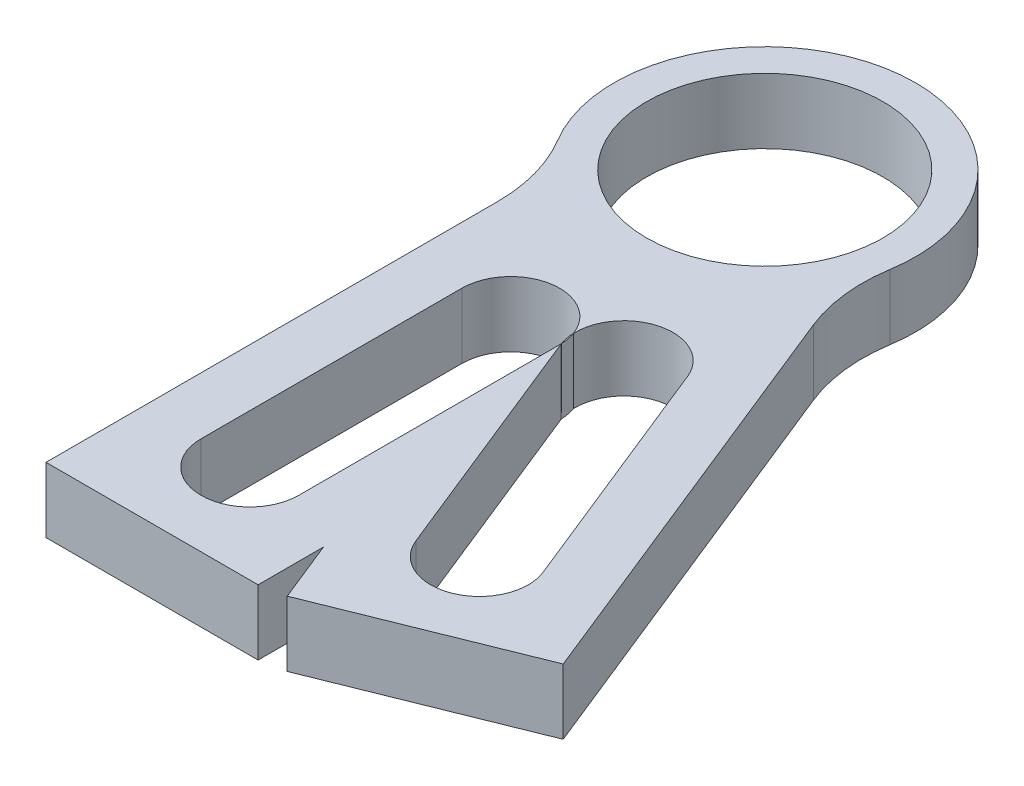
ISO-10303-21;
HEADER;
FILE_DESCRIPTION(('STEP AP214'),'2;1');
FILE_NAME('part.step','',(''),(''),'','','');
FILE_SCHEMA(('AUTOMOTIVE_DESIGN { 1 0 10303 214 1 1 1 1 }'));
ENDSEC;
DATA;
#1=APPLICATION_CONTEXT('core data for automotive mechanical design processes');
#2=APPLICATION_PROTOCOL_DEFINITION('international standard','automotive_design',2000,#1);
#3=PRODUCT_CONTEXT('',#1,'mechanical');
#4=PRODUCT('Part','Part','',(#3));
#5=PRODUCT_RELATED_PRODUCT_CATEGORY('part','',(#4));
#6=PRODUCT_DEFINITION_FORMATION('','',#4);
#7=PRODUCT_DEFINITION_CONTEXT('part definition',#1,'design');
#8=PRODUCT_DEFINITION('design','',#6,#7);
#9=PRODUCT_DEFINITION_SHAPE('','',#8);
#10=(LENGTH_UNIT() NAMED_UNIT(*) SI_UNIT(.MILLI.,.METRE.));
#11=(NAMED_UNIT(*) PLANE_ANGLE_UNIT() SI_UNIT($,.RADIAN.));
#12=(NAMED_UNIT(*) SI_UNIT($,.STERADIAN.) SOLID_ANGLE_UNIT());
#13=UNCERTAINTY_MEASURE_WITH_UNIT(LENGTH_MEASURE(1.E-05),#10,'distance_accuracy_value','');
#14=(GEOMETRIC_REPRESENTATION_CONTEXT(3) GLOBAL_UNCERTAINTY_ASSIGNED_CONTEXT((#13)) GLOBAL_UNIT_ASSIGNED_CONTEXT((#10,
#11,#12)) REPRESENTATION_CONTEXT('',''));
#15=CARTESIAN_POINT('',(0.,0.,0.));
#16=DIRECTION('',(0.,0.,1.));
#17=DIRECTION('',(1.,0.,0.));
#18=AXIS2_PLACEMENT_3D('',#15,#16,#17);
#19=CARTESIAN_POINT('',(0.,6.35,0.));
#20=DIRECTION('',(0.,-1.,0.));
#21=DIRECTION('',(0.,0.,-1.));
#22=AXIS2_PLACEMENT_3D('',#19,#20,#21);
#23=CYLINDRICAL_SURFACE('',#22,14.6812);
#24=CARTESIAN_POINT('',(0.,6.35,0.));
#25=DIRECTION('',(0.,1.,0.));
#26=DIRECTION('',(0.,0.,1.));
#27=AXIS2_PLACEMENT_3D('',#24,#25,#26);
#28=CIRCLE('',#27,14.6812);
#29=CARTESIAN_POINT('',(14.4988560701764,6.35,2.30668725585171));
#30=VERTEX_POINT('',#29);
#31=CARTESIAN_POINT('',(-12.5882442227764,6.35,7.55471646243172));
#32=VERTEX_POINT('',#31);
#33=EDGE_CURVE('E308',#30,#32,#28,.T.);
#34=ORIENTED_EDGE('',*,*,#33,.F.);
#35=DIRECTION('',(0.,-1.,0.));
#36=VECTOR('',#35,1.);
#37=CARTESIAN_POINT('',(14.4988560701764,6.35,2.30668725585171));
#38=LINE('',#37,#36);
#39=CARTESIAN_POINT('',(14.4988560701764,0.,2.30668725585171));
#40=VERTEX_POINT('',#39);
#41=EDGE_CURVE('E359',#30,#40,#38,.T.);
#42=ORIENTED_EDGE('',*,*,#41,.T.);
#43=CARTESIAN_POINT('',(0.,0.,0.));
#44=DIRECTION('',(0.,1.,0.));
#45=DIRECTION('',(0.,0.,1.));
#46=AXIS2_PLACEMENT_3D('',#43,#44,#45);
#47=CIRCLE('',#46,14.6812);
#48=CARTESIAN_POINT('',(-12.5882442227764,0.,7.55471646243172));
#49=VERTEX_POINT('',#48);
#50=EDGE_CURVE('E362',#40,#49,#47,.T.);
#51=ORIENTED_EDGE('',*,*,#50,.T.);
#52=DIRECTION('',(0.,-1.,0.));
#53=VECTOR('',#52,1.);
#54=CARTESIAN_POINT('',(-12.5882442227764,6.35,7.55471646243172));
#55=LINE('',#54,#53);
#56=EDGE_CURVE('E356',#49,#32,#55,.F.);
#57=ORIENTED_EDGE('',*,*,#56,.T.);
#58=EDGE_LOOP('',(#34,#42,#51,#57));
#59=FACE_BOUND('',#58,.T.);
#60=ADVANCED_FACE('F85',(#59),#23,.T.);
#61=CARTESIAN_POINT('',(-10.3251,6.35,0.));
#62=DIRECTION('',(1.,0.,0.));
#63=DIRECTION('',(0.,0.,-1.));
#64=AXIS2_PLACEMENT_3D('',#61,#62,#63);
#65=PLANE('',#64);
#66=DIRECTION('',(0.,0.,1.));
#67=VECTOR('',#66,1.);
#68=CARTESIAN_POINT('',(-10.3251,6.35,0.));
#69=LINE('',#68,#67);
#70=CARTESIAN_POINT('',(-10.3251,6.35,15.723743779075));
#71=VERTEX_POINT('',#70);
#72=CARTESIAN_POINT('',(-10.3251,6.35,59.6596258877065));
#73=VERTEX_POINT('',#72);
#74=EDGE_CURVE('E300',#71,#73,#69,.T.);
#75=ORIENTED_EDGE('',*,*,#74,.F.);
#76=DIRECTION('',(0.,1.,0.));
#77=VECTOR('',#76,1.);
#78=CARTESIAN_POINT('',(-10.3251,0.,15.723743779075));
#79=LINE('',#78,#77);
#80=CARTESIAN_POINT('',(-10.3251,0.,15.723743779075));
#81=VERTEX_POINT('',#80);
#82=EDGE_CURVE('E352',#71,#81,#79,.F.);
#83=ORIENTED_EDGE('',*,*,#82,.T.);
#84=DIRECTION('',(0.,0.,1.));
#85=VECTOR('',#84,1.);
#86=CARTESIAN_POINT('',(-10.3251,0.,0.));
#87=LINE('',#86,#85);
#88=CARTESIAN_POINT('',(-10.3251,0.,59.6596258877065));
#89=VERTEX_POINT('',#88);
#90=EDGE_CURVE('E355',#81,#89,#87,.T.);
#91=ORIENTED_EDGE('',*,*,#90,.T.);
#92=DIRECTION('',(0.,-1.,0.));
#93=VECTOR('',#92,1.);
#94=CARTESIAN_POINT('',(-10.3251,6.35,59.6596258877065));
#95=LINE('',#94,#93);
#96=EDGE_CURVE('E364',#73,#89,#95,.T.);
#97=ORIENTED_EDGE('',*,*,#96,.F.);
#98=EDGE_LOOP('',(#75,#83,#91,#97));
#99=FACE_BOUND('',#98,.T.);
#100=ADVANCED_FACE('F422',(#99),#65,.F.);
#101=CARTESIAN_POINT('',(0.,6.35,59.6596258877065));
#102=DIRECTION('',(0.,0.,-1.));
#103=DIRECTION('',(-1.,0.,0.));
#104=AXIS2_PLACEMENT_3D('',#101,#102,#103);
#105=PLANE('',#104);
#106=DIRECTION('',(1.,0.,0.));
#107=VECTOR('',#106,1.);
#108=CARTESIAN_POINT('',(0.,0.,59.6596258877065));
#109=LINE('',#108,#107);
#110=CARTESIAN_POINT('',(10.3251,0.,59.6596258877065));
#111=VERTEX_POINT('',#110);
#112=EDGE_CURVE('E368',#89,#111,#109,.T.);
#113=ORIENTED_EDGE('',*,*,#112,.T.);
#114=DIRECTION('',(0.,-1.,0.));
#115=VECTOR('',#114,1.);
#116=CARTESIAN_POINT('',(10.3251,6.35,59.6596258877065));
#117=LINE('',#116,#115);
#118=CARTESIAN_POINT('',(10.3251,6.35,59.6596258877065));
#119=VERTEX_POINT('',#118);
#120=EDGE_CURVE('E369',#119,#111,#117,.T.);
#121=ORIENTED_EDGE('',*,*,#120,.F.);
#122=DIRECTION('',(1.,0.,0.));
#123=VECTOR('',#122,1.);
#124=CARTESIAN_POINT('',(0.,6.35,59.6596258877065));
#125=LINE('',#124,#123);
#126=EDGE_CURVE('E294',#73,#119,#125,.T.);
#127=ORIENTED_EDGE('',*,*,#126,.F.);
#128=ORIENTED_EDGE('',*,*,#96,.T.);
#129=EDGE_LOOP('',(#113,#121,#127,#128));
#130=FACE_BOUND('',#129,.T.);
#131=ADVANCED_FACE('F427',(#130),#105,.F.);
#132=CARTESIAN_POINT('',(10.3251,6.35,0.));
#133=DIRECTION('',(-1.,0.,0.));
#134=DIRECTION('',(0.,0.,1.));
#135=AXIS2_PLACEMENT_3D('',#132,#133,#134);
#136=PLANE('',#135);
#137=DIRECTION('',(0.,0.,-1.));
#138=VECTOR('',#137,1.);
#139=CARTESIAN_POINT('',(10.3251,0.,0.));
#140=LINE('',#139,#138);
#141=CARTESIAN_POINT('',(10.3251,0.,53.2918183618538));
#142=VERTEX_POINT('',#141);
#143=EDGE_CURVE('E367',#111,#142,#140,.T.);
#144=ORIENTED_EDGE('',*,*,#143,.T.);
#145=DIRECTION('',(0.,-1.,0.));
#146=VECTOR('',#145,1.);
#147=CARTESIAN_POINT('',(10.3251,6.35,53.2918183618538));
#148=LINE('',#147,#146);
#149=CARTESIAN_POINT('',(10.3251,6.35,53.2918183618538));
#150=VERTEX_POINT('',#149);
#151=EDGE_CURVE('E372',#150,#142,#148,.T.);
#152=ORIENTED_EDGE('',*,*,#151,.F.);
#153=DIRECTION('',(0.,0.,-1.));
#154=VECTOR('',#153,1.);
#155=CARTESIAN_POINT('',(10.3251,6.35,0.));
#156=LINE('',#155,#154);
#157=EDGE_CURVE('E293',#119,#150,#156,.T.);
#158=ORIENTED_EDGE('',*,*,#157,.F.);
#159=ORIENTED_EDGE('',*,*,#120,.T.);
#160=EDGE_LOOP('',(#144,#152,#158,#159));
#161=FACE_BOUND('',#160,.T.);
#162=ADVANCED_FACE('F429',(#161),#136,.F.);
#163=CARTESIAN_POINT('',(-9.57798434184308,6.35,3.85615170311136));
#164=DIRECTION('',(-0.927640830775788,0.,0.373473545351751));
#165=DIRECTION('',(0.373473545351751,0.,0.927640830775788));
#166=AXIS2_PLACEMENT_3D('',#163,#164,#165);
#167=PLANE('',#166);
#168=DIRECTION('',(-0.373473545351751,0.,-0.927640830775788));
#169=VECTOR('',#168,1.);
#170=CARTESIAN_POINT('',(-9.57798434184308,0.,3.85615170311136));
#171=LINE('',#170,#169);
#172=CARTESIAN_POINT('',(12.7033076403695,0.,59.1988565944865));
#173=VERTEX_POINT('',#172);
#174=EDGE_CURVE('E253',#173,#142,#171,.T.);
#175=ORIENTED_EDGE('',*,*,#174,.F.);
#176=DIRECTION('',(0.,-1.,0.));
#177=VECTOR('',#176,1.);
#178=CARTESIAN_POINT('',(12.7033076403695,6.35,59.1988565944865));
#179=LINE('',#178,#177);
#180=CARTESIAN_POINT('',(12.7033076403695,6.35,59.1988565944865));
#181=VERTEX_POINT('',#180);
#182=EDGE_CURVE('E316',#181,#173,#179,.T.);
#183=ORIENTED_EDGE('',*,*,#182,.F.);
#184=DIRECTION('',(-0.373473545351751,0.,-0.927640830775788));
#185=VECTOR('',#184,1.);
#186=CARTESIAN_POINT('',(-9.57798434184308,6.35,3.85615170311136));
#187=LINE('',#186,#185);
#188=EDGE_CURVE('E303',#181,#150,#187,.T.);
#189=ORIENTED_EDGE('',*,*,#188,.T.);
#190=ORIENTED_EDGE('',*,*,#151,.T.);
#191=EDGE_LOOP('',(#175,#183,#189,#190));
#192=FACE_BOUND('',#191,.T.);
#193=ADVANCED_FACE('F401',(#192),#167,.T.);
#194=CARTESIAN_POINT('',(22.2812919822127,6.35,55.3427048913751));
#195=DIRECTION('',(0.373473545351753,0.,0.927640830775787));
#196=DIRECTION('',(0.927640830775787,0.,-0.373473545351753));
#197=AXIS2_PLACEMENT_3D('',#194,#195,#196);
#198=PLANE('',#197);
#199=DIRECTION('',(-0.927640830775787,0.,0.373473545351753));
#200=VECTOR('',#199,1.);
#201=CARTESIAN_POINT('',(22.2812919822127,0.,55.3427048913751));
#202=LINE('',#201,#200);
#203=CARTESIAN_POINT('',(31.8592763240556,0.,51.4865531882638));
#204=VERTEX_POINT('',#203);
#205=EDGE_CURVE('E379',#204,#173,#202,.T.);
#206=ORIENTED_EDGE('',*,*,#205,.F.);
#207=DIRECTION('',(0.,-1.,0.));
#208=VECTOR('',#207,1.);
#209=CARTESIAN_POINT('',(31.8592763240556,6.35,51.4865531882638));
#210=LINE('',#209,#208);
#211=CARTESIAN_POINT('',(31.8592763240556,6.35,51.4865531882638));
#212=VERTEX_POINT('',#211);
#213=EDGE_CURVE('E283',#212,#204,#210,.T.);
#214=ORIENTED_EDGE('',*,*,#213,.F.);
#215=DIRECTION('',(-0.927640830775787,0.,0.373473545351753));
#216=VECTOR('',#215,1.);
#217=CARTESIAN_POINT('',(22.2812919822127,6.35,55.3427048913751));
#218=LINE('',#217,#216);
#219=EDGE_CURVE('E374',#212,#181,#218,.T.);
#220=ORIENTED_EDGE('',*,*,#219,.T.);
#221=ORIENTED_EDGE('',*,*,#182,.T.);
#222=EDGE_LOOP('',(#206,#214,#220,#221));
#223=FACE_BOUND('',#222,.T.);
#224=ADVANCED_FACE('F397',(#223),#198,.T.);
#225=CARTESIAN_POINT('',(0.,6.35,0.));
#226=DIRECTION('',(0.,-1.,0.));
#227=DIRECTION('',(0.,0.,-1.));
#228=AXIS2_PLACEMENT_3D('',#225,#226,#227);
#229=CYLINDRICAL_SURFACE('',#228,11.5062);
#230=CARTESIAN_POINT('',(0.,6.35,0.));
#231=DIRECTION('',(0.,1.,0.));
#232=DIRECTION('',(0.,0.,1.));
#233=AXIS2_PLACEMENT_3D('',#230,#231,#232);
#234=CIRCLE('',#233,11.5062);
#235=CARTESIAN_POINT('',(0.,6.35,11.5062));
#236=VERTEX_POINT('',#235);
#237=EDGE_CURVE('E312',#236,#236,#234,.T.);
#238=ORIENTED_EDGE('',*,*,#237,.T.);
#239=EDGE_LOOP('',(#238));
#240=FACE_BOUND('',#239,.T.);
#241=CARTESIAN_POINT('',(0.,0.,0.));
#242=DIRECTION('',(0.,1.,0.));
#243=DIRECTION('',(0.,0.,1.));
#244=AXIS2_PLACEMENT_3D('',#241,#242,#243);
#245=CIRCLE('',#244,11.5062);
#246=CARTESIAN_POINT('',(0.,0.,11.5062));
#247=VERTEX_POINT('',#246);
#248=EDGE_CURVE('E229',#247,#247,#245,.T.);
#249=ORIENTED_EDGE('',*,*,#248,.F.);
#250=EDGE_LOOP('',(#249));
#251=FACE_BOUND('',#250,.T.);
#252=ADVANCED_FACE('F445',(#240,#251),#229,.F.);
#253=CARTESIAN_POINT('',(9.57798434184306,6.35,-3.85615170311136));
#254=DIRECTION('',(0.927640830775788,0.,-0.373473545351751));
#255=DIRECTION('',(-0.373473545351751,0.,-0.927640830775788));
#256=AXIS2_PLACEMENT_3D('',#253,#254,#255);
#257=PLANE('',#256);
#258=DIRECTION('',(0.373473545351751,0.,0.927640830775788));
#259=VECTOR('',#258,1.);
#260=CARTESIAN_POINT('',(9.57798434184306,0.,-3.85615170311136));
#261=LINE('',#260,#259);
#262=CARTESIAN_POINT('',(15.4503866772168,0.,10.7298350390155));
#263=VERTEX_POINT('',#262);
#264=EDGE_CURVE('E351',#263,#204,#261,.T.);
#265=ORIENTED_EDGE('',*,*,#264,.F.);
#266=DIRECTION('',(0.,-1.,0.));
#267=VECTOR('',#266,1.);
#268=CARTESIAN_POINT('',(15.4503866772168,6.35,10.7298350390155));
#269=LINE('',#268,#267);
#270=CARTESIAN_POINT('',(15.4503866772168,6.35,10.7298350390155));
#271=VERTEX_POINT('',#270);
#272=EDGE_CURVE('E315',#263,#271,#269,.F.);
#273=ORIENTED_EDGE('',*,*,#272,.T.);
#274=DIRECTION('',(0.373473545351751,0.,0.927640830775788));
#275=VECTOR('',#274,1.);
#276=CARTESIAN_POINT('',(9.57798434184306,6.35,-3.85615170311136));
#277=LINE('',#276,#275);
#278=EDGE_CURVE('E358',#271,#212,#277,.T.);
#279=ORIENTED_EDGE('',*,*,#278,.T.);
#280=ORIENTED_EDGE('',*,*,#213,.T.);
#281=EDGE_LOOP('',(#265,#273,#279,#280));
#282=FACE_BOUND('',#281,.T.);
#283=ADVANCED_FACE('F408',(#282),#257,.T.);
#284=CARTESIAN_POINT('',(0.,6.35,0.));
#285=DIRECTION('',(0.,1.,0.));
#286=DIRECTION('',(0.,0.,1.));
#287=AXIS2_PLACEMENT_3D('',#284,#285,#286);
#288=PLANE('',#287);
#289=CARTESIAN_POINT('',(9.23719507915823,6.35,22.943524177055));
#290=DIRECTION('',(0.,1.,0.));
#291=DIRECTION('',(0.,0.,1.));
#292=AXIS2_PLACEMENT_3D('',#289,#290,#291);
#293=CIRCLE('',#292,4.76250000000001);
#294=CARTESIAN_POINT('',(13.6550845357279,6.35,21.1648564173173));
#295=VERTEX_POINT('',#294);
#296=CARTESIAN_POINT('',(4.47768917193509,6.35,23.1123725383386));
#297=VERTEX_POINT('',#296);
#298=EDGE_CURVE('E278',#295,#297,#293,.T.);
#299=ORIENTED_EDGE('',*,*,#298,.F.);
#300=DIRECTION('',(0.373473545351751,0.,0.927640830775788));
#301=VECTOR('',#300,1.);
#302=CARTESIAN_POINT('',(4.41788945656968,6.35,-1.77866775973771));
#303=LINE('',#302,#301);
#304=CARTESIAN_POINT('',(23.1413125876624,6.35,44.7269335190223));
#305=VERTEX_POINT('',#304);
#306=EDGE_CURVE('E279',#295,#305,#303,.T.);
#307=ORIENTED_EDGE('',*,*,#306,.T.);
#308=CARTESIAN_POINT('',(18.7234231310927,6.35,46.50560127876));
#309=DIRECTION('',(0.,1.,0.));
#310=DIRECTION('',(0.,0.,1.));
#311=AXIS2_PLACEMENT_3D('',#308,#309,#310);
#312=CIRCLE('',#311,4.76250000000001);
#313=CARTESIAN_POINT('',(14.305533674523,6.35,48.2842690384978));
#314=VERTEX_POINT('',#313);
#315=EDGE_CURVE('E220',#314,#305,#312,.T.);
#316=ORIENTED_EDGE('',*,*,#315,.F.);
#317=DIRECTION('',(0.373473545351751,0.,0.927640830775788));
#318=VECTOR('',#317,1.);
#319=CARTESIAN_POINT('',(-4.41788945656968,6.35,1.77866775973771));
#320=LINE('',#319,#318);
#321=CARTESIAN_POINT('',(4.81930562258854,6.35,24.7221919367928));
#322=VERTEX_POINT('',#321);
#323=EDGE_CURVE('E216',#322,#314,#320,.T.);
#324=ORIENTED_EDGE('',*,*,#323,.F.);
#325=CARTESIAN_POINT('',(4.75950590722313,6.35,24.5657775264229));
#326=VERTEX_POINT('',#325);
#327=EDGE_CURVE('E94',#326,#322,#293,.T.);
#328=ORIENTED_EDGE('',*,*,#327,.F.);
#329=CARTESIAN_POINT('',(0.,6.35,24.7346258877065));
#330=DIRECTION('',(0.,1.,0.));
#331=DIRECTION('',(0.,0.,1.));
#332=AXIS2_PLACEMENT_3D('',#329,#330,#331);
#333=CIRCLE('',#332,4.7625);
#334=CARTESIAN_POINT('',(4.7625,6.35,24.7346258877065));
#335=VERTEX_POINT('',#334);
#336=EDGE_CURVE('E242',#335,#326,#333,.T.);
#337=ORIENTED_EDGE('',*,*,#336,.F.);
#338=DIRECTION('',(0.,0.,1.));
#339=VECTOR('',#338,1.);
#340=CARTESIAN_POINT('',(4.7625,6.35,0.));
#341=LINE('',#340,#339);
#342=CARTESIAN_POINT('',(4.7625,6.35,50.1346258877065));
#343=VERTEX_POINT('',#342);
#344=EDGE_CURVE('E282',#335,#343,#341,.T.);
#345=ORIENTED_EDGE('',*,*,#344,.T.);
#346=CARTESIAN_POINT('',(0.,6.35,50.1346258877065));
#347=DIRECTION('',(0.,1.,0.));
#348=DIRECTION('',(0.,0.,1.));
#349=AXIS2_PLACEMENT_3D('',#346,#347,#348);
#350=CIRCLE('',#349,4.7625);
#351=CARTESIAN_POINT('',(-4.7625,6.35,50.1346258877065));
#352=VERTEX_POINT('',#351);
#353=EDGE_CURVE('E319',#352,#343,#350,.T.);
#354=ORIENTED_EDGE('',*,*,#353,.F.);
#355=DIRECTION('',(0.,0.,-1.));
#356=VECTOR('',#355,1.);
#357=CARTESIAN_POINT('',(-4.7625,6.35,0.));
#358=LINE('',#357,#356);
#359=CARTESIAN_POINT('',(-4.7625,6.35,24.7346258877065));
#360=VERTEX_POINT('',#359);
#361=EDGE_CURVE('E257',#352,#360,#358,.T.);
#362=ORIENTED_EDGE('',*,*,#361,.T.);
#363=EDGE_CURVE('E243',#297,#360,#333,.T.);
#364=ORIENTED_EDGE('',*,*,#363,.F.);
#365=EDGE_LOOP('',(#299,#307,#316,#324,#328,#337,#345,#354,#362,#364));
#366=FACE_BOUND('',#365,.T.);
#367=ORIENTED_EDGE('',*,*,#237,.F.);
#368=EDGE_LOOP('',(#367));
#369=FACE_BOUND('',#368,.T.);
#370=ORIENTED_EDGE('',*,*,#278,.F.);
#371=CARTESIAN_POINT('',(30.1766848657824,6.35,4.8009425065564));
#372=DIRECTION('',(0.,1.,0.));
#373=DIRECTION('',(0.,0.,1.));
#374=AXIS2_PLACEMENT_3D('',#371,#372,#373);
#375=CIRCLE('',#374,15.875);
#376=EDGE_CURVE('E311',#271,#30,#375,.F.);
#377=ORIENTED_EDGE('',*,*,#376,.T.);
#378=ORIENTED_EDGE('',*,*,#33,.T.);
#379=CARTESIAN_POINT('',(-26.2001,6.35,15.723743779075));
#380=DIRECTION('',(0.,1.,0.));
#381=DIRECTION('',(0.,0.,1.));
#382=AXIS2_PLACEMENT_3D('',#379,#380,#381);
#383=CIRCLE('',#382,15.875);
#384=EDGE_CURVE('E307',#32,#71,#383,.F.);
#385=ORIENTED_EDGE('',*,*,#384,.T.);
#386=ORIENTED_EDGE('',*,*,#74,.T.);
#387=ORIENTED_EDGE('',*,*,#126,.T.);
#388=ORIENTED_EDGE('',*,*,#157,.T.);
#389=ORIENTED_EDGE('',*,*,#188,.F.);
#390=ORIENTED_EDGE('',*,*,#219,.F.);
#391=EDGE_LOOP('',(#370,#377,#378,#385,#386,#387,#388,#389,#390));
#392=FACE_BOUND('',#391,.T.);
#393=ADVANCED_FACE('F87',(#366,#369,#392),#288,.T.);
#394=CARTESIAN_POINT('',(0.,0.,0.));
#395=DIRECTION('',(0.,1.,0.));
#396=DIRECTION('',(0.,0.,1.));
#397=AXIS2_PLACEMENT_3D('',#394,#395,#396);
#398=PLANE('',#397);
#399=DIRECTION('',(0.373473545351751,0.,0.927640830775788));
#400=VECTOR('',#399,1.);
#401=CARTESIAN_POINT('',(4.41788945656968,0.,-1.77866775973771));
#402=LINE('',#401,#400);
#403=CARTESIAN_POINT('',(13.6550845357279,0.,21.1648564173173));
#404=VERTEX_POINT('',#403);
#405=CARTESIAN_POINT('',(23.1413125876624,0.,44.7269335190223));
#406=VERTEX_POINT('',#405);
#407=EDGE_CURVE('E275',#404,#406,#402,.T.);
#408=ORIENTED_EDGE('',*,*,#407,.F.);
#409=CARTESIAN_POINT('',(9.23719507915823,0.,22.943524177055));
#410=DIRECTION('',(0.,1.,0.));
#411=DIRECTION('',(0.,0.,1.));
#412=AXIS2_PLACEMENT_3D('',#409,#410,#411);
#413=CIRCLE('',#412,4.76250000000001);
#414=CARTESIAN_POINT('',(4.47768917193509,0.,23.1123725383386));
#415=VERTEX_POINT('',#414);
#416=EDGE_CURVE('E238',#404,#415,#413,.T.);
#417=ORIENTED_EDGE('',*,*,#416,.T.);
#418=CARTESIAN_POINT('',(0.,0.,24.7346258877065));
#419=DIRECTION('',(0.,1.,0.));
#420=DIRECTION('',(0.,0.,1.));
#421=AXIS2_PLACEMENT_3D('',#418,#419,#420);
#422=CIRCLE('',#421,4.7625);
#423=CARTESIAN_POINT('',(-4.7625,0.,24.7346258877065));
#424=VERTEX_POINT('',#423);
#425=EDGE_CURVE('E265',#415,#424,#422,.T.);
#426=ORIENTED_EDGE('',*,*,#425,.T.);
#427=DIRECTION('',(0.,0.,-1.));
#428=VECTOR('',#427,1.);
#429=CARTESIAN_POINT('',(-4.7625,0.,0.));
#430=LINE('',#429,#428);
#431=CARTESIAN_POINT('',(-4.7625,0.,50.1346258877065));
#432=VERTEX_POINT('',#431);
#433=EDGE_CURVE('E266',#432,#424,#430,.T.);
#434=ORIENTED_EDGE('',*,*,#433,.F.);
#435=CARTESIAN_POINT('',(0.,0.,50.1346258877065));
#436=DIRECTION('',(0.,1.,0.));
#437=DIRECTION('',(0.,0.,1.));
#438=AXIS2_PLACEMENT_3D('',#435,#436,#437);
#439=CIRCLE('',#438,4.7625);
#440=CARTESIAN_POINT('',(4.7625,0.,50.1346258877065));
#441=VERTEX_POINT('',#440);
#442=EDGE_CURVE('E262',#432,#441,#439,.T.);
#443=ORIENTED_EDGE('',*,*,#442,.T.);
#444=DIRECTION('',(0.,0.,1.));
#445=VECTOR('',#444,1.);
#446=CARTESIAN_POINT('',(4.7625,0.,0.));
#447=LINE('',#446,#445);
#448=CARTESIAN_POINT('',(4.7625,0.,24.7346258877065));
#449=VERTEX_POINT('',#448);
#450=EDGE_CURVE('E259',#449,#441,#447,.T.);
#451=ORIENTED_EDGE('',*,*,#450,.F.);
#452=CARTESIAN_POINT('',(4.75950590722313,0.,24.5657775264229));
#453=VERTEX_POINT('',#452);
#454=EDGE_CURVE('E236',#449,#453,#422,.T.);
#455=ORIENTED_EDGE('',*,*,#454,.T.);
#456=CARTESIAN_POINT('',(4.81930562258854,0.,24.7221919367928));
#457=VERTEX_POINT('',#456);
#458=EDGE_CURVE('E234',#453,#457,#413,.T.);
#459=ORIENTED_EDGE('',*,*,#458,.T.);
#460=DIRECTION('',(0.373473545351751,0.,0.927640830775788));
#461=VECTOR('',#460,1.);
#462=CARTESIAN_POINT('',(-4.41788945656968,0.,1.77866775973771));
#463=LINE('',#462,#461);
#464=CARTESIAN_POINT('',(14.305533674523,0.,48.2842690384978));
#465=VERTEX_POINT('',#464);
#466=EDGE_CURVE('E213',#457,#465,#463,.T.);
#467=ORIENTED_EDGE('',*,*,#466,.T.);
#468=CARTESIAN_POINT('',(18.7234231310927,0.,46.50560127876));
#469=DIRECTION('',(0.,1.,0.));
#470=DIRECTION('',(0.,0.,1.));
#471=AXIS2_PLACEMENT_3D('',#468,#469,#470);
#472=CIRCLE('',#471,4.76250000000001);
#473=EDGE_CURVE('E224',#465,#406,#472,.T.);
#474=ORIENTED_EDGE('',*,*,#473,.T.);
#475=EDGE_LOOP('',(#408,#417,#426,#434,#443,#451,#455,#459,#467,#474));
#476=FACE_BOUND('',#475,.T.);
#477=ORIENTED_EDGE('',*,*,#248,.T.);
#478=EDGE_LOOP('',(#477));
#479=FACE_BOUND('',#478,.T.);
#480=ORIENTED_EDGE('',*,*,#50,.F.);
#481=CARTESIAN_POINT('',(30.1766848657824,0.,4.8009425065564));
#482=DIRECTION('',(0.,1.,0.));
#483=DIRECTION('',(0.,0.,1.));
#484=AXIS2_PLACEMENT_3D('',#481,#482,#483);
#485=CIRCLE('',#484,15.875);
#486=EDGE_CURVE('E349',#40,#263,#485,.T.);
#487=ORIENTED_EDGE('',*,*,#486,.T.);
#488=ORIENTED_EDGE('',*,*,#264,.T.);
#489=ORIENTED_EDGE('',*,*,#205,.T.);
#490=ORIENTED_EDGE('',*,*,#174,.T.);
#491=ORIENTED_EDGE('',*,*,#143,.F.);
#492=ORIENTED_EDGE('',*,*,#112,.F.);
#493=ORIENTED_EDGE('',*,*,#90,.F.);
#494=CARTESIAN_POINT('',(-26.2001,0.,15.723743779075));
#495=DIRECTION('',(0.,1.,0.));
#496=DIRECTION('',(0.,0.,1.));
#497=AXIS2_PLACEMENT_3D('',#494,#495,#496);
#498=CIRCLE('',#497,15.875);
#499=EDGE_CURVE('E250',#81,#49,#498,.T.);
#500=ORIENTED_EDGE('',*,*,#499,.T.);
#501=EDGE_LOOP('',(#480,#487,#488,#489,#490,#491,#492,#493,#500));
#502=FACE_BOUND('',#501,.T.);
#503=ADVANCED_FACE('F231',(#476,#479,#502),#398,.F.);
#504=CARTESIAN_POINT('',(30.1766848657824,6.35,4.8009425065564));
#505=DIRECTION('',(0.,-1.,0.));
#506=DIRECTION('',(0.,0.,-1.));
#507=AXIS2_PLACEMENT_3D('',#504,#505,#506);
#508=CYLINDRICAL_SURFACE('',#507,15.875);
#509=ORIENTED_EDGE('',*,*,#376,.F.);
#510=ORIENTED_EDGE('',*,*,#272,.F.);
#511=ORIENTED_EDGE('',*,*,#486,.F.);
#512=ORIENTED_EDGE('',*,*,#41,.F.);
#513=EDGE_LOOP('',(#509,#510,#511,#512));
#514=FACE_BOUND('',#513,.T.);
#515=ADVANCED_FACE('F410',(#514),#508,.F.);
#516=CARTESIAN_POINT('',(-26.2001,6.35,15.723743779075));
#517=DIRECTION('',(0.,-1.,0.));
#518=DIRECTION('',(0.,0.,-1.));
#519=AXIS2_PLACEMENT_3D('',#516,#517,#518);
#520=CYLINDRICAL_SURFACE('',#519,15.875);
#521=ORIENTED_EDGE('',*,*,#384,.F.);
#522=ORIENTED_EDGE('',*,*,#56,.F.);
#523=ORIENTED_EDGE('',*,*,#499,.F.);
#524=ORIENTED_EDGE('',*,*,#82,.F.);
#525=EDGE_LOOP('',(#521,#522,#523,#524));
#526=FACE_BOUND('',#525,.T.);
#527=ADVANCED_FACE('F419',(#526),#520,.F.);
#528=CARTESIAN_POINT('',(0.,0.,24.7346258877065));
#529=DIRECTION('',(0.,1.,0.));
#530=DIRECTION('',(0.,0.,1.));
#531=AXIS2_PLACEMENT_3D('',#528,#529,#530);
#532=CYLINDRICAL_SURFACE('',#531,4.7625);
#533=ORIENTED_EDGE('',*,*,#363,.T.);
#534=DIRECTION('',(0.,1.,0.));
#535=VECTOR('',#534,1.);
#536=CARTESIAN_POINT('',(-4.7625,0.,24.7346258877065));
#537=LINE('',#536,#535);
#538=EDGE_CURVE('E268',#424,#360,#537,.T.);
#539=ORIENTED_EDGE('',*,*,#538,.F.);
#540=ORIENTED_EDGE('',*,*,#425,.F.);
#541=DIRECTION('',(0.,1.,0.));
#542=VECTOR('',#541,1.);
#543=CARTESIAN_POINT('',(4.47768917193509,0.,23.1123725383386));
#544=LINE('',#543,#542);
#545=EDGE_CURVE('E240',#415,#297,#544,.T.);
#546=ORIENTED_EDGE('',*,*,#545,.T.);
#547=EDGE_LOOP('',(#533,#539,#540,#546));
#548=FACE_BOUND('',#547,.T.);
#549=ADVANCED_FACE('F452',(#548),#532,.F.);
#550=ORIENTED_EDGE('',*,*,#336,.T.);
#551=DIRECTION('',(0.,1.,0.));
#552=VECTOR('',#551,1.);
#553=CARTESIAN_POINT('',(4.75950590722313,0.,24.5657775264229));
#554=LINE('',#553,#552);
#555=EDGE_CURVE('E13',#453,#326,#554,.T.);
#556=ORIENTED_EDGE('',*,*,#555,.F.);
#557=ORIENTED_EDGE('',*,*,#454,.F.);
#558=DIRECTION('',(0.,1.,0.));
#559=VECTOR('',#558,1.);
#560=CARTESIAN_POINT('',(4.7625,0.,24.7346258877065));
#561=LINE('',#560,#559);
#562=EDGE_CURVE('E248',#449,#335,#561,.T.);
#563=ORIENTED_EDGE('',*,*,#562,.T.);
#564=EDGE_LOOP('',(#550,#556,#557,#563));
#565=FACE_BOUND('',#564,.T.);
#566=ADVANCED_FACE('F456',(#565),#532,.F.);
#567=CARTESIAN_POINT('',(4.7625,0.,0.));
#568=DIRECTION('',(-1.,0.,0.));
#569=DIRECTION('',(0.,0.,1.));
#570=AXIS2_PLACEMENT_3D('',#567,#568,#569);
#571=PLANE('',#570);
#572=ORIENTED_EDGE('',*,*,#344,.F.);
#573=ORIENTED_EDGE('',*,*,#562,.F.);
#574=ORIENTED_EDGE('',*,*,#450,.T.);
#575=DIRECTION('',(0.,1.,0.));
#576=VECTOR('',#575,1.);
#577=CARTESIAN_POINT('',(4.7625,0.,50.1346258877065));
#578=LINE('',#577,#576);
#579=EDGE_CURVE('E261',#441,#343,#578,.T.);
#580=ORIENTED_EDGE('',*,*,#579,.T.);
#581=EDGE_LOOP('',(#572,#573,#574,#580));
#582=FACE_BOUND('',#581,.T.);
#583=ADVANCED_FACE('F338',(#582),#571,.T.);
#584=CARTESIAN_POINT('',(0.,0.,50.1346258877065));
#585=DIRECTION('',(0.,1.,0.));
#586=DIRECTION('',(0.,0.,1.));
#587=AXIS2_PLACEMENT_3D('',#584,#585,#586);
#588=CYLINDRICAL_SURFACE('',#587,4.7625);
#589=ORIENTED_EDGE('',*,*,#353,.T.);
#590=ORIENTED_EDGE('',*,*,#579,.F.);
#591=ORIENTED_EDGE('',*,*,#442,.F.);
#592=DIRECTION('',(0.,1.,0.));
#593=VECTOR('',#592,1.);
#594=CARTESIAN_POINT('',(-4.7625,0.,50.1346258877065));
#595=LINE('',#594,#593);
#596=EDGE_CURVE('E269',#432,#352,#595,.T.);
#597=ORIENTED_EDGE('',*,*,#596,.T.);
#598=EDGE_LOOP('',(#589,#590,#591,#597));
#599=FACE_BOUND('',#598,.T.);
#600=ADVANCED_FACE('F327',(#599),#588,.F.);
#601=CARTESIAN_POINT('',(-4.7625,0.,0.));
#602=DIRECTION('',(1.,0.,0.));
#603=DIRECTION('',(0.,0.,-1.));
#604=AXIS2_PLACEMENT_3D('',#601,#602,#603);
#605=PLANE('',#604);
#606=ORIENTED_EDGE('',*,*,#361,.F.);
#607=ORIENTED_EDGE('',*,*,#596,.F.);
#608=ORIENTED_EDGE('',*,*,#433,.T.);
#609=ORIENTED_EDGE('',*,*,#538,.T.);
#610=EDGE_LOOP('',(#606,#607,#608,#609));
#611=FACE_BOUND('',#610,.T.);
#612=ADVANCED_FACE('F342',(#611),#605,.T.);
#613=CARTESIAN_POINT('',(9.23719507915823,0.,22.943524177055));
#614=DIRECTION('',(0.,1.,0.));
#615=DIRECTION('',(0.,0.,1.));
#616=AXIS2_PLACEMENT_3D('',#613,#614,#615);
#617=CYLINDRICAL_SURFACE('',#616,4.76250000000001);
#618=ORIENTED_EDGE('',*,*,#298,.T.);
#619=ORIENTED_EDGE('',*,*,#545,.F.);
#620=ORIENTED_EDGE('',*,*,#416,.F.);
#621=DIRECTION('',(0.,1.,0.));
#622=VECTOR('',#621,1.);
#623=CARTESIAN_POINT('',(13.6550845357279,0.,21.1648564173173));
#624=LINE('',#623,#622);
#625=EDGE_CURVE('E276',#404,#295,#624,.T.);
#626=ORIENTED_EDGE('',*,*,#625,.T.);
#627=EDGE_LOOP('',(#618,#619,#620,#626));
#628=FACE_BOUND('',#627,.T.);
#629=ADVANCED_FACE('F472',(#628),#617,.F.);
#630=CARTESIAN_POINT('',(4.41788945656968,0.,-1.77866775973771));
#631=DIRECTION('',(-0.927640830775788,0.,0.373473545351751));
#632=DIRECTION('',(0.373473545351751,0.,0.927640830775788));
#633=AXIS2_PLACEMENT_3D('',#630,#631,#632);
#634=PLANE('',#633);
#635=ORIENTED_EDGE('',*,*,#306,.F.);
#636=ORIENTED_EDGE('',*,*,#625,.F.);
#637=ORIENTED_EDGE('',*,*,#407,.T.);
#638=DIRECTION('',(0.,1.,0.));
#639=VECTOR('',#638,1.);
#640=CARTESIAN_POINT('',(23.1413125876624,0.,44.7269335190223));
#641=LINE('',#640,#639);
#642=EDGE_CURVE('E226',#406,#305,#641,.T.);
#643=ORIENTED_EDGE('',*,*,#642,.T.);
#644=EDGE_LOOP('',(#635,#636,#637,#643));
#645=FACE_BOUND('',#644,.T.);
#646=ADVANCED_FACE('F288',(#645),#634,.T.);
#647=CARTESIAN_POINT('',(18.7234231310927,0.,46.50560127876));
#648=DIRECTION('',(0.,1.,0.));
#649=DIRECTION('',(0.,0.,1.));
#650=AXIS2_PLACEMENT_3D('',#647,#648,#649);
#651=CYLINDRICAL_SURFACE('',#650,4.76250000000001);
#652=ORIENTED_EDGE('',*,*,#315,.T.);
#653=ORIENTED_EDGE('',*,*,#642,.F.);
#654=ORIENTED_EDGE('',*,*,#473,.F.);
#655=DIRECTION('',(0.,1.,0.));
#656=VECTOR('',#655,1.);
#657=CARTESIAN_POINT('',(14.305533674523,0.,48.2842690384978));
#658=LINE('',#657,#656);
#659=EDGE_CURVE('E209',#465,#314,#658,.T.);
#660=ORIENTED_EDGE('',*,*,#659,.T.);
#661=EDGE_LOOP('',(#652,#653,#654,#660));
#662=FACE_BOUND('',#661,.T.);
#663=ADVANCED_FACE('F225',(#662),#651,.F.);
#664=CARTESIAN_POINT('',(-4.41788945656968,0.,1.77866775973771));
#665=DIRECTION('',(-0.927640830775788,0.,0.373473545351751));
#666=DIRECTION('',(0.373473545351751,0.,0.927640830775788));
#667=AXIS2_PLACEMENT_3D('',#664,#665,#666);
#668=PLANE('',#667);
#669=ORIENTED_EDGE('',*,*,#323,.T.);
#670=ORIENTED_EDGE('',*,*,#659,.F.);
#671=ORIENTED_EDGE('',*,*,#466,.F.);
#672=DIRECTION('',(0.,1.,0.));
#673=VECTOR('',#672,1.);
#674=CARTESIAN_POINT('',(4.81930562258854,0.,24.7221919367928));
#675=LINE('',#674,#673);
#676=EDGE_CURVE('E272',#457,#322,#675,.T.);
#677=ORIENTED_EDGE('',*,*,#676,.T.);
#678=EDGE_LOOP('',(#669,#670,#671,#677));
#679=FACE_BOUND('',#678,.T.);
#680=ADVANCED_FACE('F211',(#679),#668,.F.);
#681=ORIENTED_EDGE('',*,*,#327,.T.);
#682=ORIENTED_EDGE('',*,*,#676,.F.);
#683=ORIENTED_EDGE('',*,*,#458,.F.);
#684=ORIENTED_EDGE('',*,*,#555,.T.);
#685=EDGE_LOOP('',(#681,#682,#683,#684));
#686=FACE_BOUND('',#685,.T.);
#687=ADVANCED_FACE('F467',(#686),#617,.F.);
#688=CLOSED_SHELL('',(#60,#100,#131,#162,#193,#224,#252,#283,#393,#503,#515,#527,#549,#566,#583,
#600,#612,#629,#646,#663,#680,#687));
#689=MANIFOLD_SOLID_BREP('B2',#688);
#690=CARTESIAN_POINT('',(9.23719507915823,0.,22.943524177055));
#691=DIRECTION('',(0.,1.,0.));
#692=DIRECTION('',(0.,0.,1.));
#693=AXIS2_PLACEMENT_3D('',#690,#691,#692);
#694=CYLINDRICAL_SURFACE('',#693,4.76250000000001);
#695=CARTESIAN_POINT('',(9.23719507915823,6.35,22.943524177055));
#696=DIRECTION('',(0.,1.,0.));
#697=DIRECTION('',(0.,0.,1.));
#698=AXIS2_PLACEMENT_3D('',#695,#696,#697);
#699=CIRCLE('',#698,4.76250000000001);
#700=CARTESIAN_POINT('',(4.47768917193509,6.35,23.1123725383386));
#701=VERTEX_POINT('',#700);
#702=CARTESIAN_POINT('',(4.75950590722313,6.35,24.5657775264229));
#703=VERTEX_POINT('',#702);
#704=EDGE_CURVE('E717',#701,#703,#699,.T.);
#705=ORIENTED_EDGE('',*,*,#704,.F.);
#706=DIRECTION('',(0.,1.,0.));
#707=VECTOR('',#706,1.);
#708=CARTESIAN_POINT('',(4.47768917193509,0.,23.1123725383386));
#709=LINE('',#708,#707);
#710=CARTESIAN_POINT('',(4.47768917193509,0.,23.1123725383386));
#711=VERTEX_POINT('',#710);
#712=EDGE_CURVE('E83',#711,#701,#709,.T.);
#713=ORIENTED_EDGE('',*,*,#712,.F.);
#714=CARTESIAN_POINT('',(9.23719507915823,0.,22.943524177055));
#715=DIRECTION('',(0.,1.,0.));
#716=DIRECTION('',(0.,0.,1.));
#717=AXIS2_PLACEMENT_3D('',#714,#715,#716);
#718=CIRCLE('',#717,4.76250000000001);
#719=CARTESIAN_POINT('',(4.75950590722313,0.,24.5657775264229));
#720=VERTEX_POINT('',#719);
#721=EDGE_CURVE('E721',#711,#720,#718,.T.);
#722=ORIENTED_EDGE('',*,*,#721,.T.);
#723=DIRECTION('',(0.,1.,0.));
#724=VECTOR('',#723,1.);
#725=CARTESIAN_POINT('',(4.75950590722313,0.,24.5657775264229));
#726=LINE('',#725,#724);
#727=EDGE_CURVE('E694',#720,#703,#726,.T.);
#728=ORIENTED_EDGE('',*,*,#727,.T.);
#729=EDGE_LOOP('',(#705,#713,#722,#728));
#730=FACE_BOUND('',#729,.T.);
#731=ADVANCED_FACE('F690',(#730),#694,.T.);
#732=CARTESIAN_POINT('',(0.,0.,0.));
#733=DIRECTION('',(0.,1.,0.));
#734=DIRECTION('',(0.,0.,1.));
#735=AXIS2_PLACEMENT_3D('',#732,#733,#734);
#736=PLANE('',#735);
#737=CARTESIAN_POINT('',(0.,0.,24.7346258877065));
#738=DIRECTION('',(0.,1.,0.));
#739=DIRECTION('',(0.,0.,1.));
#740=AXIS2_PLACEMENT_3D('',#737,#738,#739);
#741=CIRCLE('',#740,4.7625);
#742=EDGE_CURVE('E713',#720,#711,#741,.T.);
#743=ORIENTED_EDGE('',*,*,#742,.F.);
#744=ORIENTED_EDGE('',*,*,#721,.F.);
#745=EDGE_LOOP('',(#743,#744));
#746=FACE_BOUND('',#745,.T.);
#747=ADVANCED_FACE('F692',(#746),#736,.F.);
#748=CARTESIAN_POINT('',(0.,6.35,0.));
#749=DIRECTION('',(0.,1.,0.));
#750=DIRECTION('',(0.,0.,1.));
#751=AXIS2_PLACEMENT_3D('',#748,#749,#750);
#752=PLANE('',#751);
#753=ORIENTED_EDGE('',*,*,#704,.T.);
#754=CARTESIAN_POINT('',(0.,6.35,24.7346258877065));
#755=DIRECTION('',(0.,1.,0.));
#756=DIRECTION('',(0.,0.,1.));
#757=AXIS2_PLACEMENT_3D('',#754,#755,#756);
#758=CIRCLE('',#757,4.7625);
#759=EDGE_CURVE('E718',#703,#701,#758,.T.);
#760=ORIENTED_EDGE('',*,*,#759,.T.);
#761=EDGE_LOOP('',(#753,#760));
#762=FACE_BOUND('',#761,.T.);
#763=ADVANCED_FACE('F728',(#762),#752,.T.);
#764=CARTESIAN_POINT('',(0.,0.,24.7346258877065));
#765=DIRECTION('',(0.,1.,0.));
#766=DIRECTION('',(0.,0.,1.));
#767=AXIS2_PLACEMENT_3D('',#764,#765,#766);
#768=CYLINDRICAL_SURFACE('',#767,4.7625);
#769=ORIENTED_EDGE('',*,*,#759,.F.);
#770=ORIENTED_EDGE('',*,*,#727,.F.);
#771=ORIENTED_EDGE('',*,*,#742,.T.);
#772=ORIENTED_EDGE('',*,*,#712,.T.);
#773=EDGE_LOOP('',(#769,#770,#771,#772));
#774=FACE_BOUND('',#773,.T.);
#775=ADVANCED_FACE('F714',(#774),#768,.T.);
#776=CLOSED_SHELL('',(#731,#747,#763,#775));
#777=MANIFOLD_SOLID_BREP('B7',#776);
#778=ADVANCED_BREP_SHAPE_REPRESENTATION('',(#18,#689,#777),#14);
#779=SHAPE_DEFINITION_REPRESENTATION(#9,#778);
ENDSEC;
END-ISO-10303-21;
